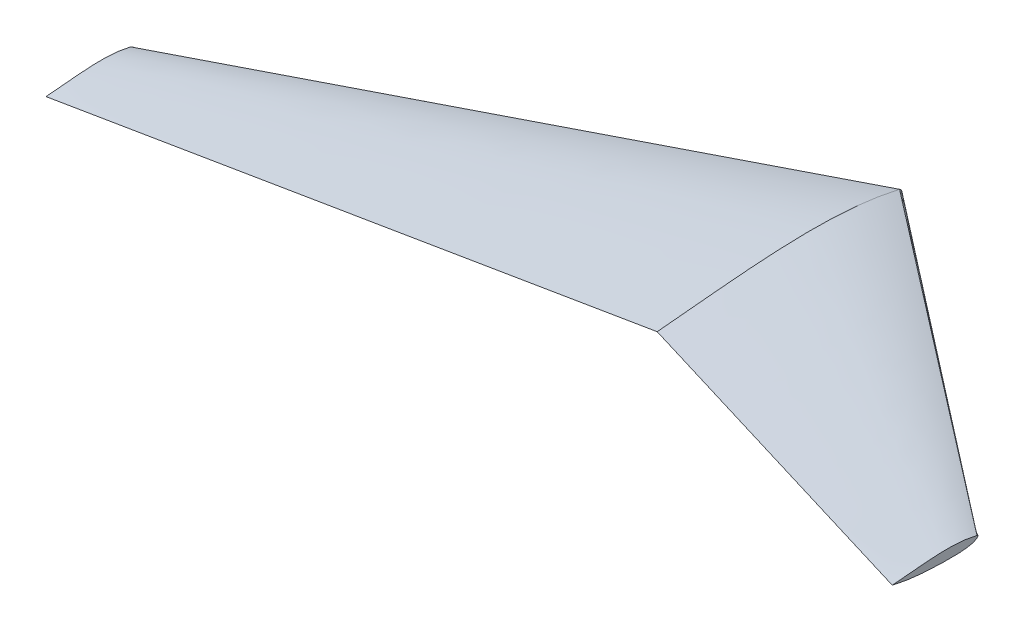
ISO-10303-21;
HEADER;
FILE_DESCRIPTION(('STEP AP214'),'2;1');
FILE_NAME('part.step','',(''),(''),'','','');
FILE_SCHEMA(('AUTOMOTIVE_DESIGN { 1 0 10303 214 1 1 1 1 }'));
ENDSEC;
DATA;
#1=APPLICATION_CONTEXT('core data for automotive mechanical design processes');
#2=APPLICATION_PROTOCOL_DEFINITION('international standard','automotive_design',2000,#1);
#3=PRODUCT_CONTEXT('',#1,'mechanical');
#4=PRODUCT('Part','Part','',(#3));
#5=PRODUCT_RELATED_PRODUCT_CATEGORY('part','',(#4));
#6=PRODUCT_DEFINITION_FORMATION('','',#4);
#7=PRODUCT_DEFINITION_CONTEXT('part definition',#1,'design');
#8=PRODUCT_DEFINITION('design','',#6,#7);
#9=PRODUCT_DEFINITION_SHAPE('','',#8);
#10=(LENGTH_UNIT() NAMED_UNIT(*) SI_UNIT(.MILLI.,.METRE.));
#11=(NAMED_UNIT(*) PLANE_ANGLE_UNIT() SI_UNIT($,.RADIAN.));
#12=(NAMED_UNIT(*) SI_UNIT($,.STERADIAN.) SOLID_ANGLE_UNIT());
#13=UNCERTAINTY_MEASURE_WITH_UNIT(LENGTH_MEASURE(1.E-05),#10,'distance_accuracy_value','');
#14=(GEOMETRIC_REPRESENTATION_CONTEXT(3) GLOBAL_UNCERTAINTY_ASSIGNED_CONTEXT((#13)) GLOBAL_UNIT_ASSIGNED_CONTEXT((#10,
#11,#12)) REPRESENTATION_CONTEXT('',''));
#15=CARTESIAN_POINT('',(0.,0.,0.));
#16=DIRECTION('',(0.,0.,1.));
#17=DIRECTION('',(1.,0.,0.));
#18=AXIS2_PLACEMENT_3D('',#15,#16,#17);
#19=CARTESIAN_POINT('',(-7316.724,1394.43396943539,35242.8388819164));
#20=DIRECTION('',(1.,0.,0.));
#21=DIRECTION('',(0.,0.,-1.));
#22=AXIS2_PLACEMENT_3D('',#19,#20,#21);
#23=PLANE('',#22);
#24=CARTESIAN_POINT('',(-7316.724,1487.82866990246,35992.8335372607));
#25=CARTESIAN_POINT('',(-7316.724,1421.53063491508,35723.0920088622));
#26=CARTESIAN_POINT('',(-7316.724,1394.69315929485,35379.9013838414));
#27=CARTESIAN_POINT('',(-7316.724,1387.98826431091,34974.1908920112));
#28=CARTESIAN_POINT('',(-7316.724,1391.67850823878,34806.5245181434));
#29=CARTESIAN_POINT('',(-7316.724,1407.20518987897,34673.4645798599));
#30=CARTESIAN_POINT('',(-7316.724,1427.791236409,34589.7444487715));
#31=CARTESIAN_POINT('',(-7316.724,1454.9522140916,34536.1147330879));
#32=CARTESIAN_POINT('',(-7316.724,1474.6856907015,34514.5724175182));
#33=CARTESIAN_POINT('',(-7316.724,1487.82866990246,34510.9312940607));
#34=B_SPLINE_CURVE_WITH_KNOTS('',3,(#24,#25,#26,#27,#28,#29,#30,#31,#32,#33),.UNSPECIFIED.,.F.,
.F.,(4,1,1,1,1,1,1,4),(0.,0.549019603267767,0.678988998646025,0.804672906893468,
0.880861609126723,0.944605534241206,0.973770910928307,1.),.UNSPECIFIED.);
#35=CARTESIAN_POINT('',(-7316.724,1487.82866990246,35992.8335372607));
#36=VERTEX_POINT('',#35);
#37=CARTESIAN_POINT('',(-7316.724,1487.82866990246,34510.9312940607));
#38=VERTEX_POINT('',#37);
#39=EDGE_CURVE('E283',#36,#38,#34,.T.);
#40=ORIENTED_EDGE('',*,*,#39,.F.);
#41=CARTESIAN_POINT('',(-7316.724,1500.88597293831,34529.2878789022));
#42=CARTESIAN_POINT('',(-7316.724,1564.84640303126,34787.5650115678));
#43=CARTESIAN_POINT('',(-7316.724,1565.95433340614,35143.3505912498));
#44=CARTESIAN_POINT('',(-7316.724,1525.47544548225,35566.0534451243));
#45=CARTESIAN_POINT('',(-7316.724,1510.03755214737,35767.7365592));
#46=CARTESIAN_POINT('',(-7316.724,1497.55370125636,35903.0681986516));
#47=CARTESIAN_POINT('',(-7316.724,1492.8497859909,35968.1104831478));
#48=CARTESIAN_POINT('',(-7316.724,1487.82866990246,35992.8335372607));
#49=B_SPLINE_CURVE_WITH_KNOTS('',3,(#41,#42,#43,#44,#45,#46,#47,#48),.UNSPECIFIED.,.F.,.F.,(4,1,
1,1,1,4),(0.,0.535773714543347,0.722503519925007,0.866976857960601,0.94863315097576,1.),.UNSPECIFIED.);
#50=CARTESIAN_POINT('',(-7316.724,1500.88597293831,34529.2878789022));
#51=VERTEX_POINT('',#50);
#52=EDGE_CURVE('E286',#51,#36,#49,.T.);
#53=ORIENTED_EDGE('',*,*,#52,.F.);
#54=CARTESIAN_POINT('',(-7316.724,1487.82866990246,34510.9312940607));
#55=CARTESIAN_POINT('',(-7316.724,1498.87260998178,34516.9128048186));
#56=CARTESIAN_POINT('',(-7316.724,1500.88597293831,34529.2878789022));
#57=B_SPLINE_CURVE_WITH_KNOTS('',2,(#54,#55,#56),.UNSPECIFIED.,.F.,.F.,(3,3),(0.,1.),.UNSPECIFIED.);
#58=EDGE_CURVE('E306',#38,#51,#57,.T.);
#59=ORIENTED_EDGE('',*,*,#58,.F.);
#60=EDGE_LOOP('',(#40,#53,#59));
#61=FACE_BOUND('',#60,.T.);
#62=ADVANCED_FACE('F72',(#61),#23,.F.);
#63=CARTESIAN_POINT('',(-7316.724,1487.82866990246,35992.8335372607));
#64=CARTESIAN_POINT('',(0.,0.,32741.10546));
#65=CARTESIAN_POINT('',(-7316.724,1421.53063491508,35723.0920088622));
#66=CARTESIAN_POINT('',(0.,-142.662359591106,32169.0055685476));
#67=CARTESIAN_POINT('',(-7316.724,1394.69315929485,35379.9013838414));
#68=CARTESIAN_POINT('',(0.,-232.168298131136,31444.6993979625));
#69=CARTESIAN_POINT('',(-7316.724,1387.98826431091,34974.1908920112));
#70=CARTESIAN_POINT('',(0.,-271.214486883912,30581.1028222455));
#71=CARTESIAN_POINT('',(-7316.724,1391.67850823878,34806.5245181434));
#72=CARTESIAN_POINT('',(0.,-279.128640205377,30224.8626713417));
#73=CARTESIAN_POINT('',(-7316.724,1407.20518987897,34673.4645798599));
#74=CARTESIAN_POINT('',(0.,-281.644558087896,29940.08999998));
#75=CARTESIAN_POINT('',(-7316.724,1427.791236409,34589.7444487715));
#76=CARTESIAN_POINT('',(0.,-281.923932183841,29759.0776698051));
#77=CARTESIAN_POINT('',(-7316.724,1454.9522140916,34536.1147330879));
#78=CARTESIAN_POINT('',(0.,-281.644221320347,29631.7219864907));
#79=CARTESIAN_POINT('',(-7316.724,1474.6856907015,34514.5724175182));
#80=CARTESIAN_POINT('',(0.,-281.400074941488,29572.5616548228));
#81=CARTESIAN_POINT('',(-7316.724,1487.82866990246,34510.9312940607));
#82=CARTESIAN_POINT('',(0.,-281.262525315798,29544.5629007834));
#83=B_SPLINE_SURFACE_WITH_KNOTS('',3,1,((#63,#64),(#65,#66),(#67,#68),(#69,#70),(#71,#72),(#73,
#74),(#75,#76),(#77,#78),(#79,#80),(#81,#82)),.UNSPECIFIED.,.F.,.F.,.F.,(4,1,1,1,1,1,1,4),(2,2),
(0.,0.549019603267767,0.678988998646025,0.804672906893468,0.880861609126723,0.944605534241206,
0.973770910928307,1.),(0.,1.),.UNSPECIFIED.);
#84=DIRECTION('',(0.811323571130646,-0.196167763900929,-0.550701617333674));
#85=VECTOR('',#84,1.);
#86=CARTESIAN_POINT('',(-3658.362,603.283072293332,32027.7470974221));
#87=LINE('',#86,#85);
#88=CARTESIAN_POINT('',(0.,-281.262525315798,29544.5629007834));
#89=VERTEX_POINT('',#88);
#90=EDGE_CURVE('E85',#38,#89,#87,.T.);
#91=CARTESIAN_POINT('',(0.,0.,32741.10546));
#92=CARTESIAN_POINT('',(0.,-259.849299992165,31699.0663633133));
#93=CARTESIAN_POINT('',(0.,-286.506688592456,30612.0324557808));
#94=CARTESIAN_POINT('',(0.,-281.262525315798,29544.5629007834));
#95=B_SPLINE_CURVE_WITH_KNOTS('',3,(#91,#92,#93,#94),.UNSPECIFIED.,.F.,.F.,(4,4),(0.,1.),.UNSPECIFIED.);
#96=CARTESIAN_POINT('',(0.,0.,32741.10546));
#97=VERTEX_POINT('',#96);
#98=EDGE_CURVE('E79',#97,#89,#95,.T.);
#99=DIRECTION('',(-0.898438710929953,0.182694177376623,0.399287766222814));
#100=VECTOR('',#99,1.);
#101=CARTESIAN_POINT('',(-3658.362,743.914334951231,34366.9694986304));
#102=LINE('',#101,#100);
#103=EDGE_CURVE('E357',#97,#36,#102,.T.);
#104=ORIENTED_EDGE('',*,*,#39,.T.);
#105=ORIENTED_EDGE('',*,*,#90,.T.);
#106=ORIENTED_EDGE('',*,*,#98,.F.);
#107=ORIENTED_EDGE('',*,*,#103,.T.);
#108=EDGE_LOOP('',(#104,#105,#106,#107));
#109=FACE_BOUND('',#108,.T.);
#110=ADVANCED_FACE('F323',(#109),#83,.T.);
#111=CARTESIAN_POINT('',(-7316.724,1487.82866990246,34510.9312940607));
#112=CARTESIAN_POINT('',(0.,-281.262525315798,29544.5629007834));
#113=CARTESIAN_POINT('',(-7316.724,1492.676465868,34513.5569098746));
#114=CARTESIAN_POINT('',(0.,-272.428974898629,29299.6403654165));
#115=CARTESIAN_POINT('',(-7316.724,1497.25978836145,34518.1490071231));
#116=CARTESIAN_POINT('',(0.,-250.673172156947,28941.2533800594));
#117=CARTESIAN_POINT('',(-7316.724,1500.07626017066,34525.3553157081));
#118=CARTESIAN_POINT('',(0.,-121.08794772606,28603.1064201219));
#119=CARTESIAN_POINT('',(-7316.724,1500.6870808713,34528.0653948707));
#120=CARTESIAN_POINT('',(0.,-13.0597199762661,28470.9044866642));
#121=CARTESIAN_POINT('',(-7316.724,1500.88597293831,34529.2878789022));
#122=CARTESIAN_POINT('',(0.,37.3551517665867,28550.6223949431));
#123=B_SPLINE_SURFACE_WITH_KNOTS('',3,1,((#111,#112),(#113,#114),(#115,#116),(#117,#118),(#119,
#120),(#121,#122)),.UNSPECIFIED.,.F.,.F.,.F.,(4,1,1,4),(2,2),(0.,0.658432941149633,
0.851821004479928,1.),(0.,1.),.UNSPECIFIED.);
#124=DIRECTION('',(0.765233778518471,-0.153066211088935,-0.625290331955662));
#125=VECTOR('',#124,1.);
#126=CARTESIAN_POINT('',(-3658.362,769.12056235245,31539.9551369226));
#127=LINE('',#126,#125);
#128=CARTESIAN_POINT('',(0.,37.3551517665866,28550.6223949431));
#129=VERTEX_POINT('',#128);
#130=EDGE_CURVE('E12',#51,#129,#127,.T.);
#131=CARTESIAN_POINT('',(0.,-281.262525315798,29544.5629007834));
#132=CARTESIAN_POINT('',(0.,-272.428974898629,29299.6403654165));
#133=CARTESIAN_POINT('',(0.,-250.673172156947,28941.2533800594));
#134=CARTESIAN_POINT('',(0.,-121.08794772606,28603.1064201219));
#135=CARTESIAN_POINT('',(0.,-13.0597199762661,28470.9044866642));
#136=CARTESIAN_POINT('',(0.,37.3551517665867,28550.6223949431));
#137=B_SPLINE_CURVE_WITH_KNOTS('',3,(#131,#132,#133,#134,#135,#136),.UNSPECIFIED.,.F.,.F.,(4,1,
1,4),(0.,0.658432941149633,0.851821004479928,1.),.UNSPECIFIED.);
#138=EDGE_CURVE('E97',#89,#129,#137,.T.);
#139=ORIENTED_EDGE('',*,*,#58,.T.);
#140=ORIENTED_EDGE('',*,*,#130,.T.);
#141=ORIENTED_EDGE('',*,*,#138,.F.);
#142=ORIENTED_EDGE('',*,*,#90,.F.);
#143=EDGE_LOOP('',(#139,#140,#141,#142));
#144=FACE_BOUND('',#143,.T.);
#145=ADVANCED_FACE('F312',(#144),#123,.T.);
#146=CARTESIAN_POINT('',(-7316.724,1500.88597293831,34529.2878789022));
#147=CARTESIAN_POINT('',(0.,37.3551517665866,28550.6223949431));
#148=CARTESIAN_POINT('',(-7316.724,1564.42387561448,34785.8588133837));
#149=CARTESIAN_POINT('',(0.,206.735400994169,29283.3414115224));
#150=CARTESIAN_POINT('',(-7316.724,1565.662563216,35049.6555102342));
#151=CARTESIAN_POINT('',(0.,211.500505822184,30039.3358234107));
#152=CARTESIAN_POINT('',(-7316.724,1541.10447204202,35402.8465373032));
#153=CARTESIAN_POINT('',(0.,153.657670513552,31051.9230751751));
#154=CARTESIAN_POINT('',(-7316.724,1525.47544548225,35566.0534451243));
#155=CARTESIAN_POINT('',(0.,116.397175309247,31519.9430497708));
#156=CARTESIAN_POINT('',(-7316.724,1510.03755214737,35767.7365592));
#157=CARTESIAN_POINT('',(0.,60.7876916962792,32096.1926510893));
#158=CARTESIAN_POINT('',(-7316.724,1497.55370125636,35903.0681986516));
#159=CARTESIAN_POINT('',(0.,23.5274600825777,32483.5581508809));
#160=CARTESIAN_POINT('',(-7316.724,1492.8497859909,35968.1104831478));
#161=CARTESIAN_POINT('',(0.,6.42367697739243,32669.343106672));
#162=CARTESIAN_POINT('',(-7316.724,1487.82866990246,35992.8335372607));
#163=CARTESIAN_POINT('',(0.,0.,32741.10546));
#164=B_SPLINE_SURFACE_WITH_KNOTS('',3,1,((#146,#147),(#148,#149),(#150,#151),(#152,#153),(#154,
#155),(#156,#157),(#158,#159),(#160,#161),(#162,#163)),.UNSPECIFIED.,.F.,.F.,.F.,(4,1,1,1,1,1,
4),(2,2),(0.,0.532234353046631,0.535773714543347,0.722503519925007,0.866976857960601,
0.94863315097576,1.),(0.,1.),.UNSPECIFIED.);
#165=CARTESIAN_POINT('',(0.,37.3551517665866,28550.6223949431));
#166=CARTESIAN_POINT('',(0.,206.735400994169,29283.3414115224));
#167=CARTESIAN_POINT('',(0.,215.629276708241,30694.3744491037));
#168=CARTESIAN_POINT('',(0.,58.4963935734401,32087.6107592536));
#169=CARTESIAN_POINT('',(0.,0.,32741.10546));
#170=B_SPLINE_CURVE_WITH_KNOTS('',3,(#165,#166,#167,#168,#169),.UNSPECIFIED.,.F.,.F.,(4,1,4),
(0.,0.532234353046631,1.),.UNSPECIFIED.);
#171=EDGE_CURVE('E266',#129,#97,#170,.T.);
#172=ORIENTED_EDGE('',*,*,#52,.T.);
#173=ORIENTED_EDGE('',*,*,#103,.F.);
#174=ORIENTED_EDGE('',*,*,#171,.F.);
#175=ORIENTED_EDGE('',*,*,#130,.F.);
#176=EDGE_LOOP('',(#172,#173,#174,#175));
#177=FACE_BOUND('',#176,.T.);
#178=ADVANCED_FACE('F74',(#177),#164,.T.);
#179=CARTESIAN_POINT('',(7316.724,1394.43396943539,35242.8388819164));
#180=DIRECTION('',(-1.,0.,0.));
#181=DIRECTION('',(0.,0.,-1.));
#182=AXIS2_PLACEMENT_3D('',#179,#180,#181);
#183=PLANE('',#182);
#184=CARTESIAN_POINT('',(7316.724,1487.82866990246,35992.8335372607));
#185=CARTESIAN_POINT('',(7316.724,1421.53063491508,35723.0920088622));
#186=CARTESIAN_POINT('',(7316.724,1394.69315929485,35379.9013838414));
#187=CARTESIAN_POINT('',(7316.724,1387.98826431091,34974.1908920112));
#188=CARTESIAN_POINT('',(7316.724,1391.67850823878,34806.5245181434));
#189=CARTESIAN_POINT('',(7316.724,1407.20518987897,34673.4645798599));
#190=CARTESIAN_POINT('',(7316.724,1427.791236409,34589.7444487715));
#191=CARTESIAN_POINT('',(7316.724,1454.9522140916,34536.1147330879));
#192=CARTESIAN_POINT('',(7316.724,1474.6856907015,34514.5724175182));
#193=CARTESIAN_POINT('',(7316.724,1487.82866990246,34510.9312940607));
#194=B_SPLINE_CURVE_WITH_KNOTS('',3,(#184,#185,#186,#187,#188,#189,#190,#191,#192,#193),
.UNSPECIFIED.,.F.,.F.,(4,1,1,1,1,1,1,4),(0.,0.549019603267767,0.678988998646025,
0.804672906893468,0.880861609126723,0.944605534241206,0.973770910928307,1.),.UNSPECIFIED.);
#195=CARTESIAN_POINT('',(7316.724,1487.82866990246,35992.8335372607));
#196=VERTEX_POINT('',#195);
#197=CARTESIAN_POINT('',(7316.724,1487.82866990246,34510.9312940607));
#198=VERTEX_POINT('',#197);
#199=EDGE_CURVE('E127',#196,#198,#194,.T.);
#200=ORIENTED_EDGE('',*,*,#199,.T.);
#201=CARTESIAN_POINT('',(7316.724,1487.82866990246,34510.9312940607));
#202=CARTESIAN_POINT('',(7316.724,1498.87260998178,34516.9128048186));
#203=CARTESIAN_POINT('',(7316.724,1500.88597293831,34529.2878789022));
#204=B_SPLINE_CURVE_WITH_KNOTS('',2,(#201,#202,#203),.UNSPECIFIED.,.F.,.F.,(3,3),(0.,1.),.UNSPECIFIED.);
#205=CARTESIAN_POINT('',(7316.724,1500.88597293831,34529.2878789022));
#206=VERTEX_POINT('',#205);
#207=EDGE_CURVE('E136',#198,#206,#204,.T.);
#208=ORIENTED_EDGE('',*,*,#207,.T.);
#209=CARTESIAN_POINT('',(7316.724,1500.88597293831,34529.2878789022));
#210=CARTESIAN_POINT('',(7316.724,1564.84640303126,34787.5650115678));
#211=CARTESIAN_POINT('',(7316.724,1565.95433340614,35143.3505912498));
#212=CARTESIAN_POINT('',(7316.724,1525.47544548225,35566.0534451243));
#213=CARTESIAN_POINT('',(7316.724,1510.03755214737,35767.7365592));
#214=CARTESIAN_POINT('',(7316.724,1497.55370125636,35903.0681986516));
#215=CARTESIAN_POINT('',(7316.724,1492.8497859909,35968.1104831478));
#216=CARTESIAN_POINT('',(7316.724,1487.82866990246,35992.8335372607));
#217=B_SPLINE_CURVE_WITH_KNOTS('',3,(#209,#210,#211,#212,#213,#214,#215,#216),.UNSPECIFIED.,.F.,
.F.,(4,1,1,1,1,4),(0.,0.535773714543347,0.722503519925007,0.866976857960601,0.94863315097576,
1.),.UNSPECIFIED.);
#218=EDGE_CURVE('E144',#206,#196,#217,.T.);
#219=ORIENTED_EDGE('',*,*,#218,.T.);
#220=EDGE_LOOP('',(#200,#208,#219));
#221=FACE_BOUND('',#220,.T.);
#222=ADVANCED_FACE('F148',(#221),#183,.F.);
#223=CARTESIAN_POINT('',(7316.724,1487.82866990246,35992.8335372607));
#224=CARTESIAN_POINT('',(0.,0.,32741.10546));
#225=CARTESIAN_POINT('',(7316.724,1421.53063491508,35723.0920088622));
#226=CARTESIAN_POINT('',(0.,-142.662359591106,32169.0055685476));
#227=CARTESIAN_POINT('',(7316.724,1394.69315929485,35379.9013838414));
#228=CARTESIAN_POINT('',(0.,-232.168298131136,31444.6993979625));
#229=CARTESIAN_POINT('',(7316.724,1387.98826431091,34974.1908920112));
#230=CARTESIAN_POINT('',(0.,-271.214486883912,30581.1028222455));
#231=CARTESIAN_POINT('',(7316.724,1391.67850823878,34806.5245181434));
#232=CARTESIAN_POINT('',(0.,-279.128640205377,30224.8626713417));
#233=CARTESIAN_POINT('',(7316.724,1407.20518987897,34673.4645798599));
#234=CARTESIAN_POINT('',(0.,-281.644558087896,29940.08999998));
#235=CARTESIAN_POINT('',(7316.724,1427.791236409,34589.7444487715));
#236=CARTESIAN_POINT('',(0.,-281.923932183841,29759.0776698051));
#237=CARTESIAN_POINT('',(7316.724,1454.9522140916,34536.1147330879));
#238=CARTESIAN_POINT('',(0.,-281.644221320347,29631.7219864907));
#239=CARTESIAN_POINT('',(7316.724,1474.6856907015,34514.5724175182));
#240=CARTESIAN_POINT('',(0.,-281.400074941488,29572.5616548228));
#241=CARTESIAN_POINT('',(7316.724,1487.82866990246,34510.9312940607));
#242=CARTESIAN_POINT('',(0.,-281.262525315798,29544.5629007834));
#243=B_SPLINE_SURFACE_WITH_KNOTS('',3,1,((#223,#224),(#225,#226),(#227,#228),(#229,#230),(#231,
#232),(#233,#234),(#235,#236),(#237,#238),(#239,#240),(#241,#242)),.UNSPECIFIED.,.F.,.F.,.F.,(4,
1,1,1,1,1,1,4),(2,2),(0.,0.549019603267767,0.678988998646025,0.804672906893468,
0.880861609126723,0.944605534241206,0.973770910928307,1.),(0.,1.),.UNSPECIFIED.);
#244=DIRECTION('',(0.898438710929953,0.182694177376623,0.399287766222814));
#245=VECTOR('',#244,1.);
#246=CARTESIAN_POINT('',(3658.362,743.914334951231,34366.9694986304));
#247=LINE('',#246,#245);
#248=EDGE_CURVE('E133',#97,#196,#247,.T.);
#249=DIRECTION('',(-0.811323571130646,-0.196167763900929,-0.550701617333674));
#250=VECTOR('',#249,1.);
#251=CARTESIAN_POINT('',(3658.362,603.283072293332,32027.7470974221));
#252=LINE('',#251,#250);
#253=EDGE_CURVE('E122',#198,#89,#252,.T.);
#254=ORIENTED_EDGE('',*,*,#199,.F.);
#255=ORIENTED_EDGE('',*,*,#248,.F.);
#256=ORIENTED_EDGE('',*,*,#98,.T.);
#257=ORIENTED_EDGE('',*,*,#253,.F.);
#258=EDGE_LOOP('',(#254,#255,#256,#257));
#259=FACE_BOUND('',#258,.T.);
#260=ADVANCED_FACE('F124',(#259),#243,.F.);
#261=CARTESIAN_POINT('',(7316.724,1487.82866990246,34510.9312940607));
#262=CARTESIAN_POINT('',(0.,-281.262525315798,29544.5629007834));
#263=CARTESIAN_POINT('',(7316.724,1492.676465868,34513.5569098746));
#264=CARTESIAN_POINT('',(0.,-272.428974898629,29299.6403654165));
#265=CARTESIAN_POINT('',(7316.724,1497.25978836145,34518.1490071231));
#266=CARTESIAN_POINT('',(0.,-250.673172156947,28941.2533800594));
#267=CARTESIAN_POINT('',(7316.724,1500.07626017066,34525.3553157081));
#268=CARTESIAN_POINT('',(0.,-121.08794772606,28603.1064201219));
#269=CARTESIAN_POINT('',(7316.724,1500.6870808713,34528.0653948707));
#270=CARTESIAN_POINT('',(0.,-13.0597199762661,28470.9044866642));
#271=CARTESIAN_POINT('',(7316.724,1500.88597293831,34529.2878789022));
#272=CARTESIAN_POINT('',(0.,37.3551517665867,28550.6223949431));
#273=B_SPLINE_SURFACE_WITH_KNOTS('',3,1,((#261,#262),(#263,#264),(#265,#266),(#267,#268),(#269,
#270),(#271,#272)),.UNSPECIFIED.,.F.,.F.,.F.,(4,1,1,4),(2,2),(0.,0.658432941149633,
0.851821004479928,1.),(0.,1.),.UNSPECIFIED.);
#274=DIRECTION('',(-0.765233778518471,-0.153066211088935,-0.625290331955662));
#275=VECTOR('',#274,1.);
#276=CARTESIAN_POINT('',(3658.362,769.12056235245,31539.9551369226));
#277=LINE('',#276,#275);
#278=EDGE_CURVE('E132',#206,#129,#277,.T.);
#279=ORIENTED_EDGE('',*,*,#207,.F.);
#280=ORIENTED_EDGE('',*,*,#253,.T.);
#281=ORIENTED_EDGE('',*,*,#138,.T.);
#282=ORIENTED_EDGE('',*,*,#278,.F.);
#283=EDGE_LOOP('',(#279,#280,#281,#282));
#284=FACE_BOUND('',#283,.T.);
#285=ADVANCED_FACE('F138',(#284),#273,.F.);
#286=CARTESIAN_POINT('',(7316.724,1500.88597293831,34529.2878789022));
#287=CARTESIAN_POINT('',(0.,37.3551517665866,28550.6223949431));
#288=CARTESIAN_POINT('',(7316.724,1564.42387561448,34785.8588133837));
#289=CARTESIAN_POINT('',(0.,206.735400994169,29283.3414115224));
#290=CARTESIAN_POINT('',(7316.724,1565.662563216,35049.6555102342));
#291=CARTESIAN_POINT('',(0.,211.500505822184,30039.3358234107));
#292=CARTESIAN_POINT('',(7316.724,1541.10447204202,35402.8465373032));
#293=CARTESIAN_POINT('',(0.,153.657670513552,31051.9230751751));
#294=CARTESIAN_POINT('',(7316.724,1525.47544548225,35566.0534451243));
#295=CARTESIAN_POINT('',(0.,116.397175309247,31519.9430497708));
#296=CARTESIAN_POINT('',(7316.724,1510.03755214737,35767.7365592));
#297=CARTESIAN_POINT('',(0.,60.7876916962792,32096.1926510893));
#298=CARTESIAN_POINT('',(7316.724,1497.55370125636,35903.0681986516));
#299=CARTESIAN_POINT('',(0.,23.5274600825777,32483.5581508809));
#300=CARTESIAN_POINT('',(7316.724,1492.8497859909,35968.1104831478));
#301=CARTESIAN_POINT('',(0.,6.42367697739243,32669.343106672));
#302=CARTESIAN_POINT('',(7316.724,1487.82866990246,35992.8335372607));
#303=CARTESIAN_POINT('',(0.,0.,32741.10546));
#304=B_SPLINE_SURFACE_WITH_KNOTS('',3,1,((#286,#287),(#288,#289),(#290,#291),(#292,#293),(#294,
#295),(#296,#297),(#298,#299),(#300,#301),(#302,#303)),.UNSPECIFIED.,.F.,.F.,.F.,(4,1,1,1,1,1,
4),(2,2),(0.,0.532234353046631,0.535773714543347,0.722503519925007,0.866976857960601,
0.94863315097576,1.),(0.,1.),.UNSPECIFIED.);
#305=ORIENTED_EDGE('',*,*,#218,.F.);
#306=ORIENTED_EDGE('',*,*,#278,.T.);
#307=ORIENTED_EDGE('',*,*,#171,.T.);
#308=ORIENTED_EDGE('',*,*,#248,.T.);
#309=EDGE_LOOP('',(#305,#306,#307,#308));
#310=FACE_BOUND('',#309,.T.);
#311=ADVANCED_FACE('F219',(#310),#304,.F.);
#312=CLOSED_SHELL('',(#62,#110,#145,#178,#222,#260,#285,#311));
#313=MANIFOLD_SOLID_BREP('B2',#312);
#314=ADVANCED_BREP_SHAPE_REPRESENTATION('',(#18,#313),#14);
#315=SHAPE_DEFINITION_REPRESENTATION(#9,#314);
ENDSEC;
END-ISO-10303-21;
